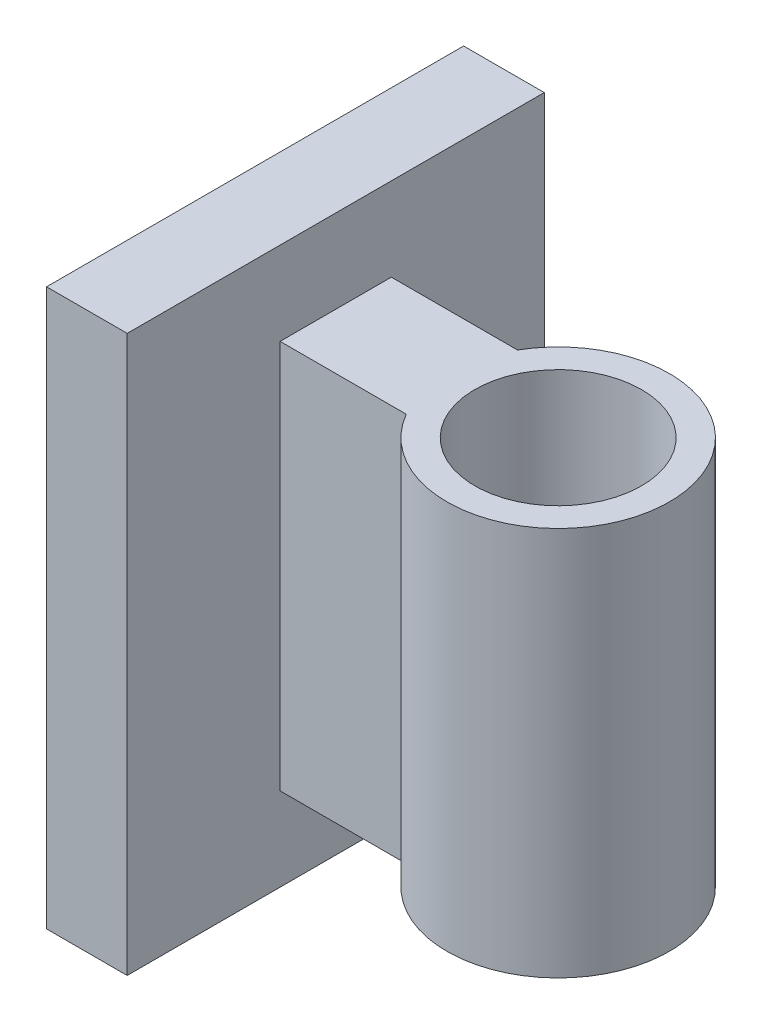
ISO-10303-21;
HEADER;
FILE_DESCRIPTION(('STEP AP214'),'2;1');
FILE_NAME('part.step','',(''),(''),'','','');
FILE_SCHEMA(('AUTOMOTIVE_DESIGN { 1 0 10303 214 1 1 1 1 }'));
ENDSEC;
DATA;
#1=APPLICATION_CONTEXT('core data for automotive mechanical design processes');
#2=APPLICATION_PROTOCOL_DEFINITION('international standard','automotive_design',2000,#1);
#3=PRODUCT_CONTEXT('',#1,'mechanical');
#4=PRODUCT('Part','Part','',(#3));
#5=PRODUCT_RELATED_PRODUCT_CATEGORY('part','',(#4));
#6=PRODUCT_DEFINITION_FORMATION('','',#4);
#7=PRODUCT_DEFINITION_CONTEXT('part definition',#1,'design');
#8=PRODUCT_DEFINITION('design','',#6,#7);
#9=PRODUCT_DEFINITION_SHAPE('','',#8);
#10=(LENGTH_UNIT() NAMED_UNIT(*) SI_UNIT(.MILLI.,.METRE.));
#11=(NAMED_UNIT(*) PLANE_ANGLE_UNIT() SI_UNIT($,.RADIAN.));
#12=(NAMED_UNIT(*) SI_UNIT($,.STERADIAN.) SOLID_ANGLE_UNIT());
#13=UNCERTAINTY_MEASURE_WITH_UNIT(LENGTH_MEASURE(1.E-05),#10,'distance_accuracy_value','');
#14=(GEOMETRIC_REPRESENTATION_CONTEXT(3) GLOBAL_UNCERTAINTY_ASSIGNED_CONTEXT((#13)) GLOBAL_UNIT_ASSIGNED_CONTEXT((#10,
#11,#12)) REPRESENTATION_CONTEXT('',''));
#15=CARTESIAN_POINT('',(0.,0.,0.));
#16=DIRECTION('',(0.,0.,1.));
#17=DIRECTION('',(1.,0.,0.));
#18=AXIS2_PLACEMENT_3D('',#15,#16,#17);
#19=CARTESIAN_POINT('',(2.9,0.,0.));
#20=DIRECTION('',(-1.,0.,0.));
#21=DIRECTION('',(0.,0.,1.));
#22=AXIS2_PLACEMENT_3D('',#19,#20,#21);
#23=PLANE('',#22);
#24=DIRECTION('',(0.,-1.,0.));
#25=VECTOR('',#24,1.);
#26=CARTESIAN_POINT('',(2.9,0.,0.));
#27=LINE('',#26,#25);
#28=CARTESIAN_POINT('',(2.9,20.,0.));
#29=VERTEX_POINT('',#28);
#30=CARTESIAN_POINT('',(2.9,0.,0.));
#31=VERTEX_POINT('',#30);
#32=EDGE_CURVE('E140',#29,#31,#27,.T.);
#33=ORIENTED_EDGE('',*,*,#32,.T.);
#34=DIRECTION('',(0.,0.,-1.));
#35=VECTOR('',#34,1.);
#36=CARTESIAN_POINT('',(2.9,0.,0.));
#37=LINE('',#36,#35);
#38=CARTESIAN_POINT('',(2.9,0.,-15.));
#39=VERTEX_POINT('',#38);
#40=EDGE_CURVE('E143',#31,#39,#37,.T.);
#41=ORIENTED_EDGE('',*,*,#40,.T.);
#42=DIRECTION('',(0.,1.,0.));
#43=VECTOR('',#42,1.);
#44=CARTESIAN_POINT('',(2.9,0.,-15.));
#45=LINE('',#44,#43);
#46=CARTESIAN_POINT('',(2.9,20.,-15.));
#47=VERTEX_POINT('',#46);
#48=EDGE_CURVE('E146',#39,#47,#45,.T.);
#49=ORIENTED_EDGE('',*,*,#48,.T.);
#50=DIRECTION('',(0.,0.,1.));
#51=VECTOR('',#50,1.);
#52=CARTESIAN_POINT('',(2.9,20.,0.));
#53=LINE('',#52,#51);
#54=EDGE_CURVE('E148',#47,#29,#53,.T.);
#55=ORIENTED_EDGE('',*,*,#54,.T.);
#56=EDGE_LOOP('',(#33,#41,#49,#55));
#57=FACE_BOUND('',#56,.T.);
#58=DIRECTION('',(0.,-1.,0.));
#59=VECTOR('',#58,1.);
#60=CARTESIAN_POINT('',(2.9,3.,-5.5));
#61=LINE('',#60,#59);
#62=CARTESIAN_POINT('',(2.9,17.,-5.5));
#63=VERTEX_POINT('',#62);
#64=CARTESIAN_POINT('',(2.9,3.,-5.5));
#65=VERTEX_POINT('',#64);
#66=EDGE_CURVE('E54',#63,#65,#61,.T.);
#67=ORIENTED_EDGE('',*,*,#66,.F.);
#68=DIRECTION('',(0.,0.,1.));
#69=VECTOR('',#68,1.);
#70=CARTESIAN_POINT('',(2.9,17.,-9.5));
#71=LINE('',#70,#69);
#72=CARTESIAN_POINT('',(2.9,17.,-9.5));
#73=VERTEX_POINT('',#72);
#74=EDGE_CURVE('E59',#73,#63,#71,.T.);
#75=ORIENTED_EDGE('',*,*,#74,.F.);
#76=DIRECTION('',(0.,1.,0.));
#77=VECTOR('',#76,1.);
#78=CARTESIAN_POINT('',(2.9,3.,-9.5));
#79=LINE('',#78,#77);
#80=CARTESIAN_POINT('',(2.9,3.,-9.5));
#81=VERTEX_POINT('',#80);
#82=EDGE_CURVE('E124',#81,#73,#79,.T.);
#83=ORIENTED_EDGE('',*,*,#82,.F.);
#84=DIRECTION('',(0.,0.,-1.));
#85=VECTOR('',#84,1.);
#86=CARTESIAN_POINT('',(2.9,3.,-5.5));
#87=LINE('',#86,#85);
#88=EDGE_CURVE('E121',#65,#81,#87,.T.);
#89=ORIENTED_EDGE('',*,*,#88,.F.);
#90=EDGE_LOOP('',(#67,#75,#83,#89));
#91=FACE_BOUND('',#90,.T.);
#92=ADVANCED_FACE('F39',(#57,#91),#23,.F.);
#93=CARTESIAN_POINT('',(2.9,0.,0.));
#94=DIRECTION('',(0.,0.,-1.));
#95=DIRECTION('',(-1.,0.,0.));
#96=AXIS2_PLACEMENT_3D('',#93,#94,#95);
#97=PLANE('',#96);
#98=DIRECTION('',(0.,-1.,0.));
#99=VECTOR('',#98,1.);
#100=CARTESIAN_POINT('',(0.,0.,0.));
#101=LINE('',#100,#99);
#102=CARTESIAN_POINT('',(0.,20.,0.));
#103=VERTEX_POINT('',#102);
#104=CARTESIAN_POINT('',(0.,0.,0.));
#105=VERTEX_POINT('',#104);
#106=EDGE_CURVE('E151',#103,#105,#101,.T.);
#107=ORIENTED_EDGE('',*,*,#106,.T.);
#108=DIRECTION('',(-1.,0.,0.));
#109=VECTOR('',#108,1.);
#110=CARTESIAN_POINT('',(2.9,0.,0.));
#111=LINE('',#110,#109);
#112=EDGE_CURVE('E11',#31,#105,#111,.T.);
#113=ORIENTED_EDGE('',*,*,#112,.F.);
#114=ORIENTED_EDGE('',*,*,#32,.F.);
#115=DIRECTION('',(-1.,0.,0.));
#116=VECTOR('',#115,1.);
#117=CARTESIAN_POINT('',(2.9,20.,0.));
#118=LINE('',#117,#116);
#119=EDGE_CURVE('E150',#29,#103,#118,.T.);
#120=ORIENTED_EDGE('',*,*,#119,.T.);
#121=EDGE_LOOP('',(#107,#113,#114,#120));
#122=FACE_BOUND('',#121,.T.);
#123=ADVANCED_FACE('F41',(#122),#97,.F.);
#124=CARTESIAN_POINT('',(2.9,0.,0.));
#125=DIRECTION('',(0.,1.,0.));
#126=DIRECTION('',(0.,0.,1.));
#127=AXIS2_PLACEMENT_3D('',#124,#125,#126);
#128=PLANE('',#127);
#129=DIRECTION('',(0.,0.,-1.));
#130=VECTOR('',#129,1.);
#131=CARTESIAN_POINT('',(0.,0.,0.));
#132=LINE('',#131,#130);
#133=CARTESIAN_POINT('',(0.,0.,-15.));
#134=VERTEX_POINT('',#133);
#135=EDGE_CURVE('E154',#105,#134,#132,.T.);
#136=ORIENTED_EDGE('',*,*,#135,.T.);
#137=DIRECTION('',(-1.,0.,0.));
#138=VECTOR('',#137,1.);
#139=CARTESIAN_POINT('',(2.9,0.,-15.));
#140=LINE('',#139,#138);
#141=EDGE_CURVE('E47',#39,#134,#140,.T.);
#142=ORIENTED_EDGE('',*,*,#141,.F.);
#143=ORIENTED_EDGE('',*,*,#40,.F.);
#144=ORIENTED_EDGE('',*,*,#112,.T.);
#145=EDGE_LOOP('',(#136,#142,#143,#144));
#146=FACE_BOUND('',#145,.T.);
#147=ADVANCED_FACE('F183',(#146),#128,.F.);
#148=CARTESIAN_POINT('',(2.9,0.,-15.));
#149=DIRECTION('',(0.,0.,1.));
#150=DIRECTION('',(1.,0.,0.));
#151=AXIS2_PLACEMENT_3D('',#148,#149,#150);
#152=PLANE('',#151);
#153=DIRECTION('',(0.,1.,0.));
#154=VECTOR('',#153,1.);
#155=CARTESIAN_POINT('',(0.,0.,-15.));
#156=LINE('',#155,#154);
#157=CARTESIAN_POINT('',(0.,20.,-15.));
#158=VERTEX_POINT('',#157);
#159=EDGE_CURVE('E156',#134,#158,#156,.T.);
#160=ORIENTED_EDGE('',*,*,#159,.T.);
#161=DIRECTION('',(-1.,0.,0.));
#162=VECTOR('',#161,1.);
#163=CARTESIAN_POINT('',(2.9,20.,-15.));
#164=LINE('',#163,#162);
#165=EDGE_CURVE('E161',#47,#158,#164,.T.);
#166=ORIENTED_EDGE('',*,*,#165,.F.);
#167=ORIENTED_EDGE('',*,*,#48,.F.);
#168=ORIENTED_EDGE('',*,*,#141,.T.);
#169=EDGE_LOOP('',(#160,#166,#167,#168));
#170=FACE_BOUND('',#169,.T.);
#171=ADVANCED_FACE('F168',(#170),#152,.F.);
#172=CARTESIAN_POINT('',(2.9,20.,0.));
#173=DIRECTION('',(0.,-1.,0.));
#174=DIRECTION('',(0.,0.,-1.));
#175=AXIS2_PLACEMENT_3D('',#172,#173,#174);
#176=PLANE('',#175);
#177=DIRECTION('',(0.,0.,1.));
#178=VECTOR('',#177,1.);
#179=CARTESIAN_POINT('',(0.,20.,0.));
#180=LINE('',#179,#178);
#181=EDGE_CURVE('E144',#158,#103,#180,.T.);
#182=ORIENTED_EDGE('',*,*,#181,.T.);
#183=ORIENTED_EDGE('',*,*,#119,.F.);
#184=ORIENTED_EDGE('',*,*,#54,.F.);
#185=ORIENTED_EDGE('',*,*,#165,.T.);
#186=EDGE_LOOP('',(#182,#183,#184,#185));
#187=FACE_BOUND('',#186,.T.);
#188=ADVANCED_FACE('F177',(#187),#176,.F.);
#189=CARTESIAN_POINT('',(0.,0.,0.));
#190=DIRECTION('',(-1.,0.,0.));
#191=DIRECTION('',(0.,0.,1.));
#192=AXIS2_PLACEMENT_3D('',#189,#190,#191);
#193=PLANE('',#192);
#194=ORIENTED_EDGE('',*,*,#106,.F.);
#195=ORIENTED_EDGE('',*,*,#181,.F.);
#196=ORIENTED_EDGE('',*,*,#159,.F.);
#197=ORIENTED_EDGE('',*,*,#135,.F.);
#198=EDGE_LOOP('',(#194,#195,#196,#197));
#199=FACE_BOUND('',#198,.T.);
#200=ADVANCED_FACE('F174',(#199),#193,.T.);
#201=CARTESIAN_POINT('',(14.901,17.,-9.5));
#202=DIRECTION('',(0.,-1.,0.));
#203=DIRECTION('',(0.,0.,-1.));
#204=AXIS2_PLACEMENT_3D('',#201,#202,#203);
#205=PLANE('',#204);
#206=DIRECTION('',(-1.,0.,0.));
#207=VECTOR('',#206,1.);
#208=CARTESIAN_POINT('',(14.901,17.,-5.5));
#209=LINE('',#208,#207);
#210=CARTESIAN_POINT('',(7.43589838486225,17.,-5.5));
#211=VERTEX_POINT('',#210);
#212=EDGE_CURVE('E134',#211,#63,#209,.T.);
#213=ORIENTED_EDGE('',*,*,#212,.F.);
#214=CARTESIAN_POINT('',(10.9,17.,-7.5));
#215=DIRECTION('',(0.,-1.,0.));
#216=DIRECTION('',(0.,0.,-1.));
#217=AXIS2_PLACEMENT_3D('',#214,#215,#216);
#218=CIRCLE('',#217,4.);
#219=CARTESIAN_POINT('',(7.43589838486225,17.,-9.5));
#220=VERTEX_POINT('',#219);
#221=EDGE_CURVE('E113',#220,#211,#218,.T.);
#222=ORIENTED_EDGE('',*,*,#221,.F.);
#223=DIRECTION('',(-1.,0.,0.));
#224=VECTOR('',#223,1.);
#225=CARTESIAN_POINT('',(14.901,17.,-9.5));
#226=LINE('',#225,#224);
#227=EDGE_CURVE('E128',#220,#73,#226,.T.);
#228=ORIENTED_EDGE('',*,*,#227,.T.);
#229=ORIENTED_EDGE('',*,*,#74,.T.);
#230=EDGE_LOOP('',(#213,#222,#228,#229));
#231=FACE_BOUND('',#230,.T.);
#232=CARTESIAN_POINT('',(10.9,17.,-7.5));
#233=DIRECTION('',(0.,-1.,0.));
#234=DIRECTION('',(0.,0.,-1.));
#235=AXIS2_PLACEMENT_3D('',#232,#233,#234);
#236=CIRCLE('',#235,3.);
#237=CARTESIAN_POINT('',(10.9,17.,-10.5));
#238=VERTEX_POINT('',#237);
#239=EDGE_CURVE('E139',#238,#238,#236,.T.);
#240=ORIENTED_EDGE('',*,*,#239,.T.);
#241=EDGE_LOOP('',(#240));
#242=FACE_BOUND('',#241,.T.);
#243=ADVANCED_FACE('F200',(#231,#242),#205,.F.);
#244=CARTESIAN_POINT('',(14.901,3.,-9.5));
#245=DIRECTION('',(0.,0.,1.));
#246=DIRECTION('',(1.,0.,0.));
#247=AXIS2_PLACEMENT_3D('',#244,#245,#246);
#248=PLANE('',#247);
#249=ORIENTED_EDGE('',*,*,#227,.F.);
#250=DIRECTION('',(0.,-1.,0.));
#251=VECTOR('',#250,1.);
#252=CARTESIAN_POINT('',(7.43589838486225,0.,-9.5));
#253=LINE('',#252,#251);
#254=CARTESIAN_POINT('',(7.43589838486225,3.,-9.5));
#255=VERTEX_POINT('',#254);
#256=EDGE_CURVE('E106',#220,#255,#253,.T.);
#257=ORIENTED_EDGE('',*,*,#256,.T.);
#258=DIRECTION('',(-1.,0.,0.));
#259=VECTOR('',#258,1.);
#260=CARTESIAN_POINT('',(14.901,3.,-9.5));
#261=LINE('',#260,#259);
#262=EDGE_CURVE('E118',#255,#81,#261,.T.);
#263=ORIENTED_EDGE('',*,*,#262,.T.);
#264=ORIENTED_EDGE('',*,*,#82,.T.);
#265=EDGE_LOOP('',(#249,#257,#263,#264));
#266=FACE_BOUND('',#265,.T.);
#267=ADVANCED_FACE('F127',(#266),#248,.F.);
#268=CARTESIAN_POINT('',(14.901,3.,-5.5));
#269=DIRECTION('',(0.,1.,0.));
#270=DIRECTION('',(0.,0.,1.));
#271=AXIS2_PLACEMENT_3D('',#268,#269,#270);
#272=PLANE('',#271);
#273=ORIENTED_EDGE('',*,*,#262,.F.);
#274=CARTESIAN_POINT('',(10.9,3.,-7.5));
#275=DIRECTION('',(0.,-1.,0.));
#276=DIRECTION('',(0.,0.,-1.));
#277=AXIS2_PLACEMENT_3D('',#274,#275,#276);
#278=CIRCLE('',#277,4.);
#279=CARTESIAN_POINT('',(7.43589838486225,3.,-5.5));
#280=VERTEX_POINT('',#279);
#281=EDGE_CURVE('E102',#255,#280,#278,.T.);
#282=ORIENTED_EDGE('',*,*,#281,.T.);
#283=DIRECTION('',(-1.,0.,0.));
#284=VECTOR('',#283,1.);
#285=CARTESIAN_POINT('',(14.901,3.,-5.5));
#286=LINE('',#285,#284);
#287=EDGE_CURVE('E136',#280,#65,#286,.T.);
#288=ORIENTED_EDGE('',*,*,#287,.T.);
#289=ORIENTED_EDGE('',*,*,#88,.T.);
#290=EDGE_LOOP('',(#273,#282,#288,#289));
#291=FACE_BOUND('',#290,.T.);
#292=CARTESIAN_POINT('',(10.9,3.,-7.5));
#293=DIRECTION('',(0.,-1.,0.));
#294=DIRECTION('',(0.,0.,-1.));
#295=AXIS2_PLACEMENT_3D('',#292,#293,#294);
#296=CIRCLE('',#295,3.);
#297=CARTESIAN_POINT('',(10.9,3.,-10.5));
#298=VERTEX_POINT('',#297);
#299=EDGE_CURVE('E114',#298,#298,#296,.T.);
#300=ORIENTED_EDGE('',*,*,#299,.F.);
#301=EDGE_LOOP('',(#300));
#302=FACE_BOUND('',#301,.T.);
#303=ADVANCED_FACE('F119',(#291,#302),#272,.F.);
#304=CARTESIAN_POINT('',(14.901,3.,-5.5));
#305=DIRECTION('',(0.,0.,-1.));
#306=DIRECTION('',(-1.,0.,0.));
#307=AXIS2_PLACEMENT_3D('',#304,#305,#306);
#308=PLANE('',#307);
#309=ORIENTED_EDGE('',*,*,#287,.F.);
#310=DIRECTION('',(0.,-1.,0.));
#311=VECTOR('',#310,1.);
#312=CARTESIAN_POINT('',(7.43589838486225,0.,-5.5));
#313=LINE('',#312,#311);
#314=EDGE_CURVE('E109',#280,#211,#313,.F.);
#315=ORIENTED_EDGE('',*,*,#314,.T.);
#316=ORIENTED_EDGE('',*,*,#212,.T.);
#317=ORIENTED_EDGE('',*,*,#66,.T.);
#318=EDGE_LOOP('',(#309,#315,#316,#317));
#319=FACE_BOUND('',#318,.T.);
#320=ADVANCED_FACE('F220',(#319),#308,.F.);
#321=CARTESIAN_POINT('',(10.9,0.,-7.5));
#322=DIRECTION('',(0.,-1.,0.));
#323=DIRECTION('',(0.,0.,-1.));
#324=AXIS2_PLACEMENT_3D('',#321,#322,#323);
#325=CYLINDRICAL_SURFACE('',#324,4.);
#326=ORIENTED_EDGE('',*,*,#256,.F.);
#327=ORIENTED_EDGE('',*,*,#221,.T.);
#328=ORIENTED_EDGE('',*,*,#314,.F.);
#329=ORIENTED_EDGE('',*,*,#281,.F.);
#330=EDGE_LOOP('',(#326,#327,#328,#329));
#331=FACE_BOUND('',#330,.T.);
#332=ADVANCED_FACE('F104',(#331),#325,.T.);
#333=CARTESIAN_POINT('',(10.9,0.,-7.5));
#334=DIRECTION('',(0.,-1.,0.));
#335=DIRECTION('',(0.,0.,-1.));
#336=AXIS2_PLACEMENT_3D('',#333,#334,#335);
#337=CYLINDRICAL_SURFACE('',#336,3.);
#338=ORIENTED_EDGE('',*,*,#299,.T.);
#339=EDGE_LOOP('',(#338));
#340=FACE_BOUND('',#339,.T.);
#341=ORIENTED_EDGE('',*,*,#239,.F.);
#342=EDGE_LOOP('',(#341));
#343=FACE_BOUND('',#342,.T.);
#344=ADVANCED_FACE('F219',(#340,#343),#337,.F.);
#345=CLOSED_SHELL('',(#92,#123,#147,#171,#188,#200,#243,#267,#303,#320,#332,#344));
#346=MANIFOLD_SOLID_BREP('B2',#345);
#347=ADVANCED_BREP_SHAPE_REPRESENTATION('',(#18,#346),#14);
#348=SHAPE_DEFINITION_REPRESENTATION(#9,#347);
ENDSEC;
END-ISO-10303-21;
